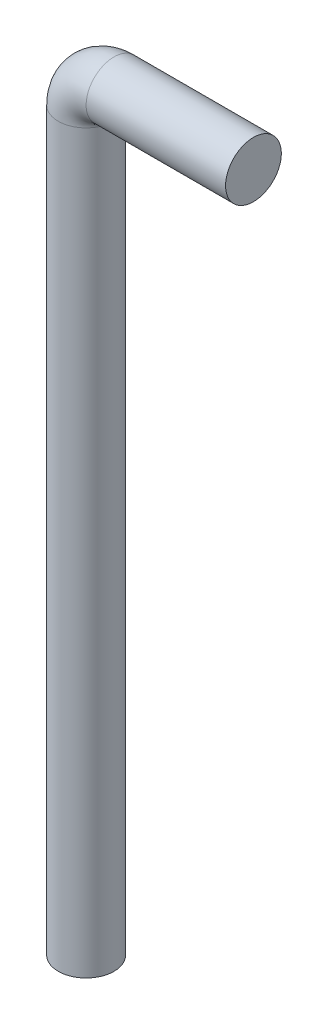
ISO-10303-21;
HEADER;
FILE_DESCRIPTION(('STEP AP214'),'2;1');
FILE_NAME('part.step','',(''),(''),'','','');
FILE_SCHEMA(('AUTOMOTIVE_DESIGN { 1 0 10303 214 1 1 1 1 }'));
ENDSEC;
DATA;
#1=APPLICATION_CONTEXT('core data for automotive mechanical design processes');
#2=APPLICATION_PROTOCOL_DEFINITION('international standard','automotive_design',2000,#1);
#3=PRODUCT_CONTEXT('',#1,'mechanical');
#4=PRODUCT('Part','Part','',(#3));
#5=PRODUCT_RELATED_PRODUCT_CATEGORY('part','',(#4));
#6=PRODUCT_DEFINITION_FORMATION('','',#4);
#7=PRODUCT_DEFINITION_CONTEXT('part definition',#1,'design');
#8=PRODUCT_DEFINITION('design','',#6,#7);
#9=PRODUCT_DEFINITION_SHAPE('','',#8);
#10=(LENGTH_UNIT() NAMED_UNIT(*) SI_UNIT(.MILLI.,.METRE.));
#11=(NAMED_UNIT(*) PLANE_ANGLE_UNIT() SI_UNIT($,.RADIAN.));
#12=(NAMED_UNIT(*) SI_UNIT($,.STERADIAN.) SOLID_ANGLE_UNIT());
#13=UNCERTAINTY_MEASURE_WITH_UNIT(LENGTH_MEASURE(1.E-05),#10,'distance_accuracy_value','');
#14=(GEOMETRIC_REPRESENTATION_CONTEXT(3) GLOBAL_UNCERTAINTY_ASSIGNED_CONTEXT((#13)) GLOBAL_UNIT_ASSIGNED_CONTEXT((#10,
#11,#12)) REPRESENTATION_CONTEXT('',''));
#15=CARTESIAN_POINT('',(0.,0.,0.));
#16=DIRECTION('',(0.,0.,1.));
#17=DIRECTION('',(1.,0.,0.));
#18=AXIS2_PLACEMENT_3D('',#15,#16,#17);
#19=CARTESIAN_POINT('',(0.,66.,0.));
#20=DIRECTION('',(0.,-1.,0.));
#21=DIRECTION('',(0.,0.,-1.));
#22=AXIS2_PLACEMENT_3D('',#19,#20,#21);
#23=CYLINDRICAL_SURFACE('',#22,2.5);
#24=CARTESIAN_POINT('',(0.,66.,0.));
#25=DIRECTION('',(0.,1.,0.));
#26=DIRECTION('',(0.,0.,1.));
#27=AXIS2_PLACEMENT_3D('',#24,#25,#26);
#28=CIRCLE('',#27,2.5);
#29=CARTESIAN_POINT('',(2.5,66.,0.));
#30=VERTEX_POINT('',#29);
#31=EDGE_CURVE('E11',#30,#30,#28,.T.);
#32=ORIENTED_EDGE('',*,*,#31,.F.);
#33=EDGE_LOOP('',(#32));
#34=FACE_BOUND('',#33,.T.);
#35=CARTESIAN_POINT('',(0.,0.,0.));
#36=DIRECTION('',(0.,1.,0.));
#37=DIRECTION('',(0.,0.,1.));
#38=AXIS2_PLACEMENT_3D('',#35,#36,#37);
#39=CIRCLE('',#38,2.5);
#40=CARTESIAN_POINT('',(0.,0.,2.5));
#41=VERTEX_POINT('',#40);
#42=EDGE_CURVE('E38',#41,#41,#39,.T.);
#43=ORIENTED_EDGE('',*,*,#42,.T.);
#44=EDGE_LOOP('',(#43));
#45=FACE_BOUND('',#44,.T.);
#46=ADVANCED_FACE('F35',(#34,#45),#23,.T.);
#47=CARTESIAN_POINT('',(0.,0.,0.));
#48=DIRECTION('',(0.,1.,0.));
#49=DIRECTION('',(0.,0.,1.));
#50=AXIS2_PLACEMENT_3D('',#47,#48,#49);
#51=PLANE('',#50);
#52=ORIENTED_EDGE('',*,*,#42,.F.);
#53=EDGE_LOOP('',(#52));
#54=FACE_BOUND('',#53,.T.);
#55=ADVANCED_FACE('F61',(#54),#51,.F.);
#56=CARTESIAN_POINT('',(2.5,68.5,0.));
#57=DIRECTION('',(1.,0.,0.));
#58=DIRECTION('',(0.,0.,-1.));
#59=AXIS2_PLACEMENT_3D('',#56,#57,#58);
#60=CYLINDRICAL_SURFACE('',#59,2.5);
#61=CARTESIAN_POINT('',(15.,68.5,0.));
#62=DIRECTION('',(1.,0.,0.));
#63=DIRECTION('',(0.,0.,1.));
#64=AXIS2_PLACEMENT_3D('',#61,#62,#63);
#65=CIRCLE('',#64,2.5);
#66=CARTESIAN_POINT('',(15.,68.5,2.5));
#67=VERTEX_POINT('',#66);
#68=EDGE_CURVE('E52',#67,#67,#65,.T.);
#69=ORIENTED_EDGE('',*,*,#68,.F.);
#70=EDGE_LOOP('',(#69));
#71=FACE_BOUND('',#70,.T.);
#72=CARTESIAN_POINT('',(2.5,68.5,0.));
#73=DIRECTION('',(1.,0.,0.));
#74=DIRECTION('',(0.,0.,1.));
#75=AXIS2_PLACEMENT_3D('',#72,#73,#74);
#76=CIRCLE('',#75,2.5);
#77=EDGE_CURVE('E49',#30,#30,#76,.T.);
#78=ORIENTED_EDGE('',*,*,#77,.T.);
#79=EDGE_LOOP('',(#78));
#80=FACE_BOUND('',#79,.T.);
#81=ADVANCED_FACE('F51',(#71,#80),#60,.T.);
#82=CARTESIAN_POINT('',(4.99999999999999,66.,0.));
#83=DIRECTION('',(0.,-1.,0.));
#84=DIRECTION('',(1.,0.,0.));
#85=AXIS2_PLACEMENT_3D('',#82,#83,#84);
#86=CIRCLE('',#85,2.5);
#87=TRIMMED_CURVE('',#86,(PARAMETER_VALUE(-3.14159255474667)),
(PARAMETER_VALUE(3.14159255474667)),.T.,.PARAMETER.);
#88=CARTESIAN_POINT('',(2.5,66.,0.));
#89=DIRECTION('',(0.,0.,1.));
#90=AXIS1_PLACEMENT('',#88,#89);
#91=SURFACE_OF_REVOLUTION('',#87,#90);
#92=ORIENTED_EDGE('',*,*,#77,.F.);
#93=ORIENTED_EDGE('',*,*,#31,.T.);
#94=EDGE_LOOP('',(#92,#93));
#95=FACE_BOUND('',#94,.T.);
#96=ADVANCED_FACE('F48',(#95),#91,.T.);
#97=CARTESIAN_POINT('',(15.,68.5,0.));
#98=DIRECTION('',(1.,0.,0.));
#99=DIRECTION('',(0.,0.,1.));
#100=AXIS2_PLACEMENT_3D('',#97,#98,#99);
#101=PLANE('',#100);
#102=ORIENTED_EDGE('',*,*,#68,.T.);
#103=EDGE_LOOP('',(#102));
#104=FACE_BOUND('',#103,.T.);
#105=ADVANCED_FACE('F72',(#104),#101,.T.);
#106=CLOSED_SHELL('',(#46,#55,#81,#96,#105));
#107=MANIFOLD_SOLID_BREP('B2',#106);
#108=ADVANCED_BREP_SHAPE_REPRESENTATION('',(#18,#107),#14);
#109=SHAPE_DEFINITION_REPRESENTATION(#9,#108);
ENDSEC;
END-ISO-10303-21;
